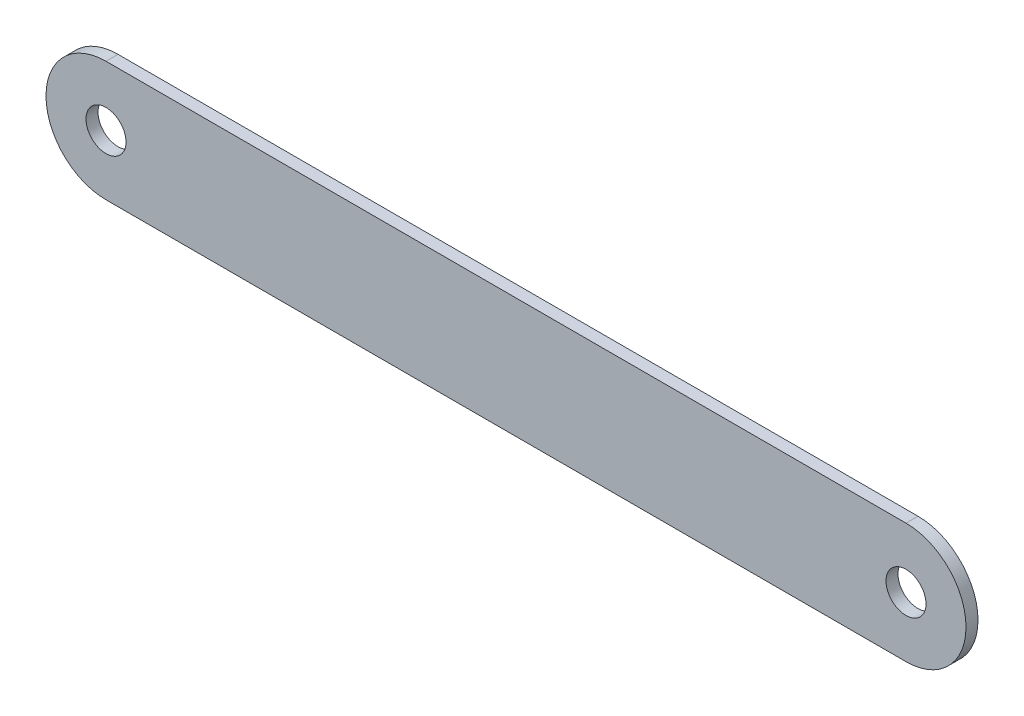
ISO-10303-21;
HEADER;
FILE_DESCRIPTION(('STEP AP214'),'2;1');
FILE_NAME('part.step','',(''),(''),'','','');
FILE_SCHEMA(('AUTOMOTIVE_DESIGN { 1 0 10303 214 1 1 1 1 }'));
ENDSEC;
DATA;
#1=APPLICATION_CONTEXT('core data for automotive mechanical design processes');
#2=APPLICATION_PROTOCOL_DEFINITION('international standard','automotive_design',2000,#1);
#3=PRODUCT_CONTEXT('',#1,'mechanical');
#4=PRODUCT('Part','Part','',(#3));
#5=PRODUCT_RELATED_PRODUCT_CATEGORY('part','',(#4));
#6=PRODUCT_DEFINITION_FORMATION('','',#4);
#7=PRODUCT_DEFINITION_CONTEXT('part definition',#1,'design');
#8=PRODUCT_DEFINITION('design','',#6,#7);
#9=PRODUCT_DEFINITION_SHAPE('','',#8);
#10=(LENGTH_UNIT() NAMED_UNIT(*) SI_UNIT(.MILLI.,.METRE.));
#11=(NAMED_UNIT(*) PLANE_ANGLE_UNIT() SI_UNIT($,.RADIAN.));
#12=(NAMED_UNIT(*) SI_UNIT($,.STERADIAN.) SOLID_ANGLE_UNIT());
#13=UNCERTAINTY_MEASURE_WITH_UNIT(LENGTH_MEASURE(1.E-05),#10,'distance_accuracy_value','');
#14=(GEOMETRIC_REPRESENTATION_CONTEXT(3) GLOBAL_UNCERTAINTY_ASSIGNED_CONTEXT((#13)) GLOBAL_UNIT_ASSIGNED_CONTEXT((#10,
#11,#12)) REPRESENTATION_CONTEXT('',''));
#15=CARTESIAN_POINT('',(0.,0.,0.));
#16=DIRECTION('',(0.,0.,1.));
#17=DIRECTION('',(1.,0.,0.));
#18=AXIS2_PLACEMENT_3D('',#15,#16,#17);
#19=CARTESIAN_POINT('',(0.,0.,3.));
#20=DIRECTION('',(0.,0.,1.));
#21=DIRECTION('',(1.,0.,0.));
#22=AXIS2_PLACEMENT_3D('',#19,#20,#21);
#23=PLANE('',#22);
#24=CARTESIAN_POINT('',(0.,0.,3.));
#25=DIRECTION('',(0.,0.,1.));
#26=DIRECTION('',(1.,0.,0.));
#27=AXIS2_PLACEMENT_3D('',#24,#25,#26);
#28=CIRCLE('',#27,5.);
#29=CARTESIAN_POINT('',(5.,0.,3.));
#30=VERTEX_POINT('',#29);
#31=EDGE_CURVE('E101',#30,#30,#28,.T.);
#32=ORIENTED_EDGE('',*,*,#31,.F.);
#33=EDGE_LOOP('',(#32));
#34=FACE_BOUND('',#33,.T.);
#35=CARTESIAN_POINT('',(0.,0.,3.));
#36=DIRECTION('',(0.,0.,1.));
#37=DIRECTION('',(1.,0.,0.));
#38=AXIS2_PLACEMENT_3D('',#35,#36,#37);
#39=CIRCLE('',#38,15.);
#40=CARTESIAN_POINT('',(0.,15.,3.));
#41=VERTEX_POINT('',#40);
#42=CARTESIAN_POINT('',(0.,-15.,3.));
#43=VERTEX_POINT('',#42);
#44=EDGE_CURVE('E86',#41,#43,#39,.T.);
#45=ORIENTED_EDGE('',*,*,#44,.T.);
#46=DIRECTION('',(1.,0.,0.));
#47=VECTOR('',#46,1.);
#48=CARTESIAN_POINT('',(0.,-15.,3.));
#49=LINE('',#48,#47);
#50=CARTESIAN_POINT('',(200.,-15.,3.));
#51=VERTEX_POINT('',#50);
#52=EDGE_CURVE('E81',#43,#51,#49,.T.);
#53=ORIENTED_EDGE('',*,*,#52,.T.);
#54=CARTESIAN_POINT('',(200.,0.,3.));
#55=DIRECTION('',(0.,0.,1.));
#56=DIRECTION('',(-1.,0.,0.));
#57=AXIS2_PLACEMENT_3D('',#54,#55,#56);
#58=CIRCLE('',#57,15.);
#59=CARTESIAN_POINT('',(200.,15.,3.));
#60=VERTEX_POINT('',#59);
#61=EDGE_CURVE('E84',#51,#60,#58,.T.);
#62=ORIENTED_EDGE('',*,*,#61,.T.);
#63=DIRECTION('',(-1.,0.,0.));
#64=VECTOR('',#63,1.);
#65=CARTESIAN_POINT('',(0.,15.,3.));
#66=LINE('',#65,#64);
#67=EDGE_CURVE('E51',#60,#41,#66,.T.);
#68=ORIENTED_EDGE('',*,*,#67,.T.);
#69=EDGE_LOOP('',(#45,#53,#62,#68));
#70=FACE_BOUND('',#69,.T.);
#71=CARTESIAN_POINT('',(200.,0.,3.));
#72=DIRECTION('',(0.,0.,1.));
#73=DIRECTION('',(1.,0.,0.));
#74=AXIS2_PLACEMENT_3D('',#71,#72,#73);
#75=CIRCLE('',#74,4.99999999999999);
#76=CARTESIAN_POINT('',(205.,0.,3.));
#77=VERTEX_POINT('',#76);
#78=EDGE_CURVE('E116',#77,#77,#75,.T.);
#79=ORIENTED_EDGE('',*,*,#78,.F.);
#80=EDGE_LOOP('',(#79));
#81=FACE_BOUND('',#80,.T.);
#82=ADVANCED_FACE('F34',(#34,#70,#81),#23,.T.);
#83=CARTESIAN_POINT('',(0.,0.,0.));
#84=DIRECTION('',(0.,0.,1.));
#85=DIRECTION('',(1.,0.,0.));
#86=AXIS2_PLACEMENT_3D('',#83,#84,#85);
#87=PLANE('',#86);
#88=CARTESIAN_POINT('',(0.,0.,0.));
#89=DIRECTION('',(0.,0.,1.));
#90=DIRECTION('',(1.,0.,0.));
#91=AXIS2_PLACEMENT_3D('',#88,#89,#90);
#92=CIRCLE('',#91,15.);
#93=CARTESIAN_POINT('',(0.,15.,0.));
#94=VERTEX_POINT('',#93);
#95=CARTESIAN_POINT('',(0.,-15.,0.));
#96=VERTEX_POINT('',#95);
#97=EDGE_CURVE('E98',#94,#96,#92,.T.);
#98=ORIENTED_EDGE('',*,*,#97,.F.);
#99=DIRECTION('',(-1.,0.,0.));
#100=VECTOR('',#99,1.);
#101=CARTESIAN_POINT('',(0.,15.,0.));
#102=LINE('',#101,#100);
#103=CARTESIAN_POINT('',(200.,15.,0.));
#104=VERTEX_POINT('',#103);
#105=EDGE_CURVE('E74',#104,#94,#102,.T.);
#106=ORIENTED_EDGE('',*,*,#105,.F.);
#107=CARTESIAN_POINT('',(200.,0.,0.));
#108=DIRECTION('',(0.,0.,1.));
#109=DIRECTION('',(-1.,0.,0.));
#110=AXIS2_PLACEMENT_3D('',#107,#108,#109);
#111=CIRCLE('',#110,15.);
#112=CARTESIAN_POINT('',(200.,-15.,0.));
#113=VERTEX_POINT('',#112);
#114=EDGE_CURVE('E68',#113,#104,#111,.T.);
#115=ORIENTED_EDGE('',*,*,#114,.F.);
#116=DIRECTION('',(1.,0.,0.));
#117=VECTOR('',#116,1.);
#118=CARTESIAN_POINT('',(0.,-15.,0.));
#119=LINE('',#118,#117);
#120=EDGE_CURVE('E90',#96,#113,#119,.T.);
#121=ORIENTED_EDGE('',*,*,#120,.F.);
#122=EDGE_LOOP('',(#98,#106,#115,#121));
#123=FACE_BOUND('',#122,.T.);
#124=CARTESIAN_POINT('',(0.,0.,0.));
#125=DIRECTION('',(0.,0.,1.));
#126=DIRECTION('',(1.,0.,0.));
#127=AXIS2_PLACEMENT_3D('',#124,#125,#126);
#128=CIRCLE('',#127,5.);
#129=CARTESIAN_POINT('',(5.,0.,0.));
#130=VERTEX_POINT('',#129);
#131=EDGE_CURVE('E113',#130,#130,#128,.T.);
#132=ORIENTED_EDGE('',*,*,#131,.T.);
#133=EDGE_LOOP('',(#132));
#134=FACE_BOUND('',#133,.T.);
#135=CARTESIAN_POINT('',(200.,0.,0.));
#136=DIRECTION('',(0.,0.,1.));
#137=DIRECTION('',(1.,0.,0.));
#138=AXIS2_PLACEMENT_3D('',#135,#136,#137);
#139=CIRCLE('',#138,4.99999999999999);
#140=CARTESIAN_POINT('',(205.,0.,0.));
#141=VERTEX_POINT('',#140);
#142=EDGE_CURVE('E119',#141,#141,#139,.T.);
#143=ORIENTED_EDGE('',*,*,#142,.T.);
#144=EDGE_LOOP('',(#143));
#145=FACE_BOUND('',#144,.T.);
#146=ADVANCED_FACE('F109',(#123,#134,#145),#87,.F.);
#147=CARTESIAN_POINT('',(0.,0.,3.));
#148=DIRECTION('',(0.,0.,-1.));
#149=DIRECTION('',(-1.,0.,0.));
#150=AXIS2_PLACEMENT_3D('',#147,#148,#149);
#151=CYLINDRICAL_SURFACE('',#150,15.);
#152=ORIENTED_EDGE('',*,*,#97,.T.);
#153=DIRECTION('',(0.,0.,-1.));
#154=VECTOR('',#153,1.);
#155=CARTESIAN_POINT('',(0.,-15.,3.));
#156=LINE('',#155,#154);
#157=EDGE_CURVE('E11',#43,#96,#156,.T.);
#158=ORIENTED_EDGE('',*,*,#157,.F.);
#159=ORIENTED_EDGE('',*,*,#44,.F.);
#160=DIRECTION('',(0.,0.,-1.));
#161=VECTOR('',#160,1.);
#162=CARTESIAN_POINT('',(0.,15.,3.));
#163=LINE('',#162,#161);
#164=EDGE_CURVE('E94',#41,#94,#163,.T.);
#165=ORIENTED_EDGE('',*,*,#164,.T.);
#166=EDGE_LOOP('',(#152,#158,#159,#165));
#167=FACE_BOUND('',#166,.T.);
#168=ADVANCED_FACE('F36',(#167),#151,.T.);
#169=CARTESIAN_POINT('',(0.,-15.,3.));
#170=DIRECTION('',(0.,1.,0.));
#171=DIRECTION('',(0.,0.,1.));
#172=AXIS2_PLACEMENT_3D('',#169,#170,#171);
#173=PLANE('',#172);
#174=ORIENTED_EDGE('',*,*,#120,.T.);
#175=DIRECTION('',(0.,0.,-1.));
#176=VECTOR('',#175,1.);
#177=CARTESIAN_POINT('',(200.,-15.,3.));
#178=LINE('',#177,#176);
#179=EDGE_CURVE('E43',#51,#113,#178,.T.);
#180=ORIENTED_EDGE('',*,*,#179,.F.);
#181=ORIENTED_EDGE('',*,*,#52,.F.);
#182=ORIENTED_EDGE('',*,*,#157,.T.);
#183=EDGE_LOOP('',(#174,#180,#181,#182));
#184=FACE_BOUND('',#183,.T.);
#185=ADVANCED_FACE('F89',(#184),#173,.F.);
#186=CARTESIAN_POINT('',(200.,0.,3.));
#187=DIRECTION('',(0.,0.,-1.));
#188=DIRECTION('',(-1.,0.,0.));
#189=AXIS2_PLACEMENT_3D('',#186,#187,#188);
#190=CYLINDRICAL_SURFACE('',#189,15.);
#191=ORIENTED_EDGE('',*,*,#114,.T.);
#192=DIRECTION('',(0.,0.,-1.));
#193=VECTOR('',#192,1.);
#194=CARTESIAN_POINT('',(200.,15.,3.));
#195=LINE('',#194,#193);
#196=EDGE_CURVE('E91',#60,#104,#195,.T.);
#197=ORIENTED_EDGE('',*,*,#196,.F.);
#198=ORIENTED_EDGE('',*,*,#61,.F.);
#199=ORIENTED_EDGE('',*,*,#179,.T.);
#200=EDGE_LOOP('',(#191,#197,#198,#199));
#201=FACE_BOUND('',#200,.T.);
#202=ADVANCED_FACE('F92',(#201),#190,.T.);
#203=CARTESIAN_POINT('',(0.,15.,3.));
#204=DIRECTION('',(0.,-1.,0.));
#205=DIRECTION('',(0.,0.,-1.));
#206=AXIS2_PLACEMENT_3D('',#203,#204,#205);
#207=PLANE('',#206);
#208=ORIENTED_EDGE('',*,*,#105,.T.);
#209=ORIENTED_EDGE('',*,*,#164,.F.);
#210=ORIENTED_EDGE('',*,*,#67,.F.);
#211=ORIENTED_EDGE('',*,*,#196,.T.);
#212=EDGE_LOOP('',(#208,#209,#210,#211));
#213=FACE_BOUND('',#212,.T.);
#214=ADVANCED_FACE('F106',(#213),#207,.F.);
#215=CARTESIAN_POINT('',(0.,0.,3.));
#216=DIRECTION('',(0.,0.,-1.));
#217=DIRECTION('',(-1.,0.,0.));
#218=AXIS2_PLACEMENT_3D('',#215,#216,#217);
#219=CYLINDRICAL_SURFACE('',#218,5.);
#220=ORIENTED_EDGE('',*,*,#31,.T.);
#221=EDGE_LOOP('',(#220));
#222=FACE_BOUND('',#221,.T.);
#223=ORIENTED_EDGE('',*,*,#131,.F.);
#224=EDGE_LOOP('',(#223));
#225=FACE_BOUND('',#224,.T.);
#226=ADVANCED_FACE('F136',(#222,#225),#219,.F.);
#227=CARTESIAN_POINT('',(200.,0.,3.));
#228=DIRECTION('',(0.,0.,-1.));
#229=DIRECTION('',(-1.,0.,0.));
#230=AXIS2_PLACEMENT_3D('',#227,#228,#229);
#231=CYLINDRICAL_SURFACE('',#230,4.99999999999999);
#232=ORIENTED_EDGE('',*,*,#78,.T.);
#233=EDGE_LOOP('',(#232));
#234=FACE_BOUND('',#233,.T.);
#235=ORIENTED_EDGE('',*,*,#142,.F.);
#236=EDGE_LOOP('',(#235));
#237=FACE_BOUND('',#236,.T.);
#238=ADVANCED_FACE('F125',(#234,#237),#231,.F.);
#239=CLOSED_SHELL('',(#82,#146,#168,#185,#202,#214,#226,#238));
#240=MANIFOLD_SOLID_BREP('B2',#239);
#241=ADVANCED_BREP_SHAPE_REPRESENTATION('',(#18,#240),#14);
#242=SHAPE_DEFINITION_REPRESENTATION(#9,#241);
ENDSEC;
END-ISO-10303-21;
